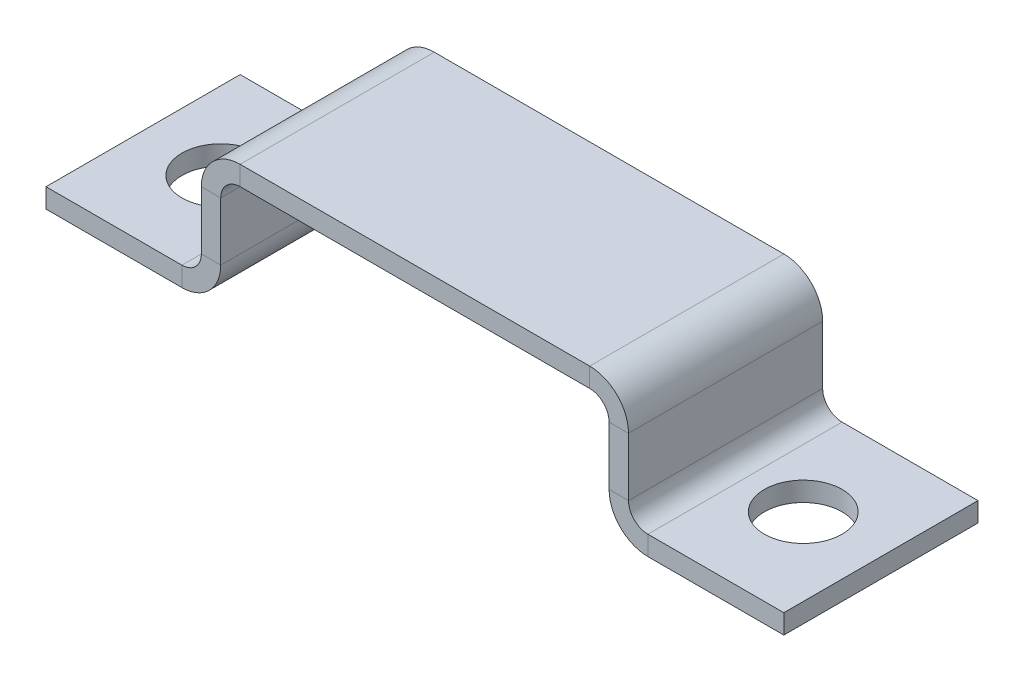
ISO-10303-21;
HEADER;
FILE_DESCRIPTION(('STEP AP214'),'2;1');
FILE_NAME('part.step','',(''),(''),'','','');
FILE_SCHEMA(('AUTOMOTIVE_DESIGN { 1 0 10303 214 1 1 1 1 }'));
ENDSEC;
DATA;
#1=APPLICATION_CONTEXT('core data for automotive mechanical design processes');
#2=APPLICATION_PROTOCOL_DEFINITION('international standard','automotive_design',2000,#1);
#3=PRODUCT_CONTEXT('',#1,'mechanical');
#4=PRODUCT('Part','Part','',(#3));
#5=PRODUCT_RELATED_PRODUCT_CATEGORY('part','',(#4));
#6=PRODUCT_DEFINITION_FORMATION('','',#4);
#7=PRODUCT_DEFINITION_CONTEXT('part definition',#1,'design');
#8=PRODUCT_DEFINITION('design','',#6,#7);
#9=PRODUCT_DEFINITION_SHAPE('','',#8);
#10=(LENGTH_UNIT() NAMED_UNIT(*) SI_UNIT(.MILLI.,.METRE.));
#11=(NAMED_UNIT(*) PLANE_ANGLE_UNIT() SI_UNIT($,.RADIAN.));
#12=(NAMED_UNIT(*) SI_UNIT($,.STERADIAN.) SOLID_ANGLE_UNIT());
#13=UNCERTAINTY_MEASURE_WITH_UNIT(LENGTH_MEASURE(1.E-05),#10,'distance_accuracy_value','');
#14=(GEOMETRIC_REPRESENTATION_CONTEXT(3) GLOBAL_UNCERTAINTY_ASSIGNED_CONTEXT((#13)) GLOBAL_UNIT_ASSIGNED_CONTEXT((#10,
#11,#12)) REPRESENTATION_CONTEXT('',''));
#15=CARTESIAN_POINT('',(0.,0.,0.));
#16=DIRECTION('',(0.,0.,1.));
#17=DIRECTION('',(1.,0.,0.));
#18=AXIS2_PLACEMENT_3D('',#15,#16,#17);
#19=CARTESIAN_POINT('',(-6.,0.,5.));
#20=DIRECTION('',(0.,0.,1.));
#21=DIRECTION('',(1.,0.,0.));
#22=AXIS2_PLACEMENT_3D('',#19,#20,#21);
#23=PLANE('',#22);
#24=DIRECTION('',(0.,1.,0.));
#25=VECTOR('',#24,1.);
#26=CARTESIAN_POINT('',(-6.,0.,5.));
#27=LINE('',#26,#25);
#28=CARTESIAN_POINT('',(-6.,0.,5.));
#29=VERTEX_POINT('',#28);
#30=CARTESIAN_POINT('',(-6.,0.5,5.));
#31=VERTEX_POINT('',#30);
#32=EDGE_CURVE('E11',#29,#31,#27,.T.);
#33=ORIENTED_EDGE('',*,*,#32,.F.);
#34=CARTESIAN_POINT('',(-6.,1.,5.));
#35=DIRECTION('',(0.,0.,-1.));
#36=DIRECTION('',(-1.,0.,0.));
#37=AXIS2_PLACEMENT_3D('',#34,#35,#36);
#38=CIRCLE('',#37,1.);
#39=CARTESIAN_POINT('',(-5.,1.,5.));
#40=VERTEX_POINT('',#39);
#41=EDGE_CURVE('E360',#40,#29,#38,.T.);
#42=ORIENTED_EDGE('',*,*,#41,.F.);
#43=DIRECTION('',(1.,0.,0.));
#44=VECTOR('',#43,1.);
#45=CARTESIAN_POINT('',(-5.5,1.,5.));
#46=LINE('',#45,#44);
#47=CARTESIAN_POINT('',(-5.5,1.,5.));
#48=VERTEX_POINT('',#47);
#49=EDGE_CURVE('E50',#48,#40,#46,.T.);
#50=ORIENTED_EDGE('',*,*,#49,.F.);
#51=CARTESIAN_POINT('',(-6.,1.,5.));
#52=DIRECTION('',(0.,0.,1.));
#53=DIRECTION('',(1.,0.,0.));
#54=AXIS2_PLACEMENT_3D('',#51,#52,#53);
#55=CIRCLE('',#54,0.5);
#56=EDGE_CURVE('E222',#48,#31,#55,.F.);
#57=ORIENTED_EDGE('',*,*,#56,.T.);
#58=EDGE_LOOP('',(#33,#42,#50,#57));
#59=FACE_BOUND('',#58,.T.);
#60=ADVANCED_FACE('F41',(#59),#23,.T.);
#61=CARTESIAN_POINT('',(-5.5,1.,5.));
#62=DIRECTION('',(0.,0.,1.));
#63=DIRECTION('',(1.,0.,0.));
#64=AXIS2_PLACEMENT_3D('',#61,#62,#63);
#65=PLANE('',#64);
#66=DIRECTION('',(-1.,0.,0.));
#67=VECTOR('',#66,1.);
#68=CARTESIAN_POINT('',(-9.5,0.,5.));
#69=LINE('',#68,#67);
#70=CARTESIAN_POINT('',(-9.5,0.,5.));
#71=VERTEX_POINT('',#70);
#72=EDGE_CURVE('E364',#29,#71,#69,.T.);
#73=ORIENTED_EDGE('',*,*,#72,.F.);
#74=ORIENTED_EDGE('',*,*,#32,.T.);
#75=DIRECTION('',(1.,0.,0.));
#76=VECTOR('',#75,1.);
#77=CARTESIAN_POINT('',(-9.5,0.5,5.));
#78=LINE('',#77,#76);
#79=CARTESIAN_POINT('',(-9.5,0.5,5.));
#80=VERTEX_POINT('',#79);
#81=EDGE_CURVE('E134',#31,#80,#78,.F.);
#82=ORIENTED_EDGE('',*,*,#81,.T.);
#83=DIRECTION('',(0.,1.,0.));
#84=VECTOR('',#83,1.);
#85=CARTESIAN_POINT('',(-9.5,0.,5.));
#86=LINE('',#85,#84);
#87=EDGE_CURVE('E912',#71,#80,#86,.T.);
#88=ORIENTED_EDGE('',*,*,#87,.F.);
#89=EDGE_LOOP('',(#73,#74,#82,#88));
#90=FACE_BOUND('',#89,.T.);
#91=ADVANCED_FACE('F493',(#90),#65,.T.);
#92=CARTESIAN_POINT('',(-5.,1.,0.));
#93=DIRECTION('',(0.,0.,-1.));
#94=DIRECTION('',(-1.,0.,0.));
#95=AXIS2_PLACEMENT_3D('',#92,#93,#94);
#96=PLANE('',#95);
#97=DIRECTION('',(-1.,0.,0.));
#98=VECTOR('',#97,1.);
#99=CARTESIAN_POINT('',(-5.,1.,0.));
#100=LINE('',#99,#98);
#101=CARTESIAN_POINT('',(-5.,1.,0.));
#102=VERTEX_POINT('',#101);
#103=CARTESIAN_POINT('',(-5.5,1.,0.));
#104=VERTEX_POINT('',#103);
#105=EDGE_CURVE('E121',#102,#104,#100,.T.);
#106=ORIENTED_EDGE('',*,*,#105,.F.);
#107=CARTESIAN_POINT('',(-6.,1.,0.));
#108=DIRECTION('',(0.,0.,-1.));
#109=DIRECTION('',(-1.,0.,0.));
#110=AXIS2_PLACEMENT_3D('',#107,#108,#109);
#111=CIRCLE('',#110,1.);
#112=CARTESIAN_POINT('',(-6.,0.,0.));
#113=VERTEX_POINT('',#112);
#114=EDGE_CURVE('E237',#102,#113,#111,.T.);
#115=ORIENTED_EDGE('',*,*,#114,.T.);
#116=DIRECTION('',(0.,-1.,0.));
#117=VECTOR('',#116,1.);
#118=CARTESIAN_POINT('',(-6.,0.5,0.));
#119=LINE('',#118,#117);
#120=CARTESIAN_POINT('',(-6.,0.5,0.));
#121=VERTEX_POINT('',#120);
#122=EDGE_CURVE('E128',#121,#113,#119,.T.);
#123=ORIENTED_EDGE('',*,*,#122,.F.);
#124=CARTESIAN_POINT('',(-6.,1.,0.));
#125=DIRECTION('',(0.,0.,1.));
#126=DIRECTION('',(1.,0.,0.));
#127=AXIS2_PLACEMENT_3D('',#124,#125,#126);
#128=CIRCLE('',#127,0.5);
#129=EDGE_CURVE('E280',#104,#121,#128,.F.);
#130=ORIENTED_EDGE('',*,*,#129,.F.);
#131=EDGE_LOOP('',(#106,#115,#123,#130));
#132=FACE_BOUND('',#131,.T.);
#133=ADVANCED_FACE('F497',(#132),#96,.T.);
#134=CARTESIAN_POINT('',(-6.,0.5,0.));
#135=DIRECTION('',(0.,0.,-1.));
#136=DIRECTION('',(-1.,0.,0.));
#137=AXIS2_PLACEMENT_3D('',#134,#135,#136);
#138=PLANE('',#137);
#139=DIRECTION('',(0.,-1.,0.));
#140=VECTOR('',#139,1.);
#141=CARTESIAN_POINT('',(-5.,0.,0.));
#142=LINE('',#141,#140);
#143=CARTESIAN_POINT('',(-5.,2.5,0.));
#144=VERTEX_POINT('',#143);
#145=EDGE_CURVE('E239',#144,#102,#142,.T.);
#146=ORIENTED_EDGE('',*,*,#145,.T.);
#147=ORIENTED_EDGE('',*,*,#105,.T.);
#148=DIRECTION('',(0.,1.,0.));
#149=VECTOR('',#148,1.);
#150=CARTESIAN_POINT('',(-5.5,0.,0.));
#151=LINE('',#150,#149);
#152=CARTESIAN_POINT('',(-5.5,2.5,0.));
#153=VERTEX_POINT('',#152);
#154=EDGE_CURVE('E278',#153,#104,#151,.F.);
#155=ORIENTED_EDGE('',*,*,#154,.F.);
#156=DIRECTION('',(1.,0.,0.));
#157=VECTOR('',#156,1.);
#158=CARTESIAN_POINT('',(-5.5,2.5,0.));
#159=LINE('',#158,#157);
#160=EDGE_CURVE('E346',#153,#144,#159,.T.);
#161=ORIENTED_EDGE('',*,*,#160,.T.);
#162=EDGE_LOOP('',(#146,#147,#155,#161));
#163=FACE_BOUND('',#162,.T.);
#164=ADVANCED_FACE('F413',(#163),#138,.T.);
#165=CARTESIAN_POINT('',(-5.,2.5,5.));
#166=DIRECTION('',(0.,0.,1.));
#167=DIRECTION('',(1.,0.,0.));
#168=AXIS2_PLACEMENT_3D('',#165,#166,#167);
#169=PLANE('',#168);
#170=DIRECTION('',(-1.,0.,0.));
#171=VECTOR('',#170,1.);
#172=CARTESIAN_POINT('',(-5.,2.5,5.));
#173=LINE('',#172,#171);
#174=CARTESIAN_POINT('',(-5.,2.5,5.));
#175=VERTEX_POINT('',#174);
#176=CARTESIAN_POINT('',(-5.5,2.5,5.));
#177=VERTEX_POINT('',#176);
#178=EDGE_CURVE('E186',#175,#177,#173,.T.);
#179=ORIENTED_EDGE('',*,*,#178,.F.);
#180=CARTESIAN_POINT('',(-4.5,2.5,5.));
#181=DIRECTION('',(0.,0.,1.));
#182=DIRECTION('',(1.,0.,0.));
#183=AXIS2_PLACEMENT_3D('',#180,#181,#182);
#184=CIRCLE('',#183,0.5);
#185=CARTESIAN_POINT('',(-4.5,3.,5.));
#186=VERTEX_POINT('',#185);
#187=EDGE_CURVE('E367',#186,#175,#184,.T.);
#188=ORIENTED_EDGE('',*,*,#187,.F.);
#189=DIRECTION('',(0.,-1.,0.));
#190=VECTOR('',#189,1.);
#191=CARTESIAN_POINT('',(-4.5,3.5,5.));
#192=LINE('',#191,#190);
#193=CARTESIAN_POINT('',(-4.5,3.5,5.));
#194=VERTEX_POINT('',#193);
#195=EDGE_CURVE('E198',#194,#186,#192,.T.);
#196=ORIENTED_EDGE('',*,*,#195,.F.);
#197=CARTESIAN_POINT('',(-4.5,2.5,5.));
#198=DIRECTION('',(0.,0.,1.));
#199=DIRECTION('',(1.,0.,0.));
#200=AXIS2_PLACEMENT_3D('',#197,#198,#199);
#201=CIRCLE('',#200,1.);
#202=EDGE_CURVE('E201',#194,#177,#201,.T.);
#203=ORIENTED_EDGE('',*,*,#202,.T.);
#204=EDGE_LOOP('',(#179,#188,#196,#203));
#205=FACE_BOUND('',#204,.T.);
#206=ADVANCED_FACE('F203',(#205),#169,.T.);
#207=CARTESIAN_POINT('',(-4.5,3.5,5.));
#208=DIRECTION('',(0.,0.,1.));
#209=DIRECTION('',(1.,0.,0.));
#210=AXIS2_PLACEMENT_3D('',#207,#208,#209);
#211=PLANE('',#210);
#212=DIRECTION('',(0.,-1.,0.));
#213=VECTOR('',#212,1.);
#214=CARTESIAN_POINT('',(-5.,0.,5.));
#215=LINE('',#214,#213);
#216=EDGE_CURVE('E193',#175,#40,#215,.T.);
#217=ORIENTED_EDGE('',*,*,#216,.F.);
#218=ORIENTED_EDGE('',*,*,#178,.T.);
#219=DIRECTION('',(0.,1.,0.));
#220=VECTOR('',#219,1.);
#221=CARTESIAN_POINT('',(-5.5,0.,5.));
#222=LINE('',#221,#220);
#223=EDGE_CURVE('E190',#177,#48,#222,.F.);
#224=ORIENTED_EDGE('',*,*,#223,.T.);
#225=ORIENTED_EDGE('',*,*,#49,.T.);
#226=EDGE_LOOP('',(#217,#218,#224,#225));
#227=FACE_BOUND('',#226,.T.);
#228=ADVANCED_FACE('F188',(#227),#211,.T.);
#229=CARTESIAN_POINT('',(-4.5,3.,0.));
#230=DIRECTION('',(0.,0.,-1.));
#231=DIRECTION('',(-1.,0.,0.));
#232=AXIS2_PLACEMENT_3D('',#229,#230,#231);
#233=PLANE('',#232);
#234=DIRECTION('',(0.,1.,0.));
#235=VECTOR('',#234,1.);
#236=CARTESIAN_POINT('',(-4.5,3.,0.));
#237=LINE('',#236,#235);
#238=CARTESIAN_POINT('',(-4.5,3.,0.));
#239=VERTEX_POINT('',#238);
#240=CARTESIAN_POINT('',(-4.5,3.5,0.));
#241=VERTEX_POINT('',#240);
#242=EDGE_CURVE('E348',#239,#241,#237,.T.);
#243=ORIENTED_EDGE('',*,*,#242,.F.);
#244=CARTESIAN_POINT('',(-4.5,2.5,0.));
#245=DIRECTION('',(0.,0.,1.));
#246=DIRECTION('',(1.,0.,0.));
#247=AXIS2_PLACEMENT_3D('',#244,#245,#246);
#248=CIRCLE('',#247,0.5);
#249=EDGE_CURVE('E241',#239,#144,#248,.T.);
#250=ORIENTED_EDGE('',*,*,#249,.T.);
#251=ORIENTED_EDGE('',*,*,#160,.F.);
#252=CARTESIAN_POINT('',(-4.5,2.5,0.));
#253=DIRECTION('',(0.,0.,1.));
#254=DIRECTION('',(1.,0.,0.));
#255=AXIS2_PLACEMENT_3D('',#252,#253,#254);
#256=CIRCLE('',#255,1.);
#257=EDGE_CURVE('E214',#241,#153,#256,.T.);
#258=ORIENTED_EDGE('',*,*,#257,.F.);
#259=EDGE_LOOP('',(#243,#250,#251,#258));
#260=FACE_BOUND('',#259,.T.);
#261=ADVANCED_FACE('F411',(#260),#233,.T.);
#262=CARTESIAN_POINT('',(-5.5,2.5,0.));
#263=DIRECTION('',(0.,0.,-1.));
#264=DIRECTION('',(-1.,0.,0.));
#265=AXIS2_PLACEMENT_3D('',#262,#263,#264);
#266=PLANE('',#265);
#267=DIRECTION('',(-1.,0.,0.));
#268=VECTOR('',#267,1.);
#269=CARTESIAN_POINT('',(-5.,3.,0.));
#270=LINE('',#269,#268);
#271=CARTESIAN_POINT('',(4.5,3.,0.));
#272=VERTEX_POINT('',#271);
#273=EDGE_CURVE('E244',#272,#239,#270,.T.);
#274=ORIENTED_EDGE('',*,*,#273,.T.);
#275=ORIENTED_EDGE('',*,*,#242,.T.);
#276=DIRECTION('',(-1.,0.,0.));
#277=VECTOR('',#276,1.);
#278=CARTESIAN_POINT('',(-5.,3.5,0.));
#279=LINE('',#278,#277);
#280=CARTESIAN_POINT('',(4.5,3.5,0.));
#281=VERTEX_POINT('',#280);
#282=EDGE_CURVE('E274',#281,#241,#279,.T.);
#283=ORIENTED_EDGE('',*,*,#282,.F.);
#284=DIRECTION('',(0.,-1.,0.));
#285=VECTOR('',#284,1.);
#286=CARTESIAN_POINT('',(4.5,3.5,0.));
#287=LINE('',#286,#285);
#288=EDGE_CURVE('E338',#281,#272,#287,.T.);
#289=ORIENTED_EDGE('',*,*,#288,.T.);
#290=EDGE_LOOP('',(#274,#275,#283,#289));
#291=FACE_BOUND('',#290,.T.);
#292=ADVANCED_FACE('F472',(#291),#266,.T.);
#293=CARTESIAN_POINT('',(4.5,3.,5.));
#294=DIRECTION('',(0.,0.,1.));
#295=DIRECTION('',(1.,0.,0.));
#296=AXIS2_PLACEMENT_3D('',#293,#294,#295);
#297=PLANE('',#296);
#298=DIRECTION('',(0.,1.,0.));
#299=VECTOR('',#298,1.);
#300=CARTESIAN_POINT('',(4.5,3.,5.));
#301=LINE('',#300,#299);
#302=CARTESIAN_POINT('',(4.5,3.,5.));
#303=VERTEX_POINT('',#302);
#304=CARTESIAN_POINT('',(4.5,3.5,5.));
#305=VERTEX_POINT('',#304);
#306=EDGE_CURVE('E344',#303,#305,#301,.T.);
#307=ORIENTED_EDGE('',*,*,#306,.F.);
#308=CARTESIAN_POINT('',(4.5,2.5,5.));
#309=DIRECTION('',(0.,0.,1.));
#310=DIRECTION('',(1.,0.,0.));
#311=AXIS2_PLACEMENT_3D('',#308,#309,#310);
#312=CIRCLE('',#311,0.5);
#313=CARTESIAN_POINT('',(5.,2.5,5.));
#314=VERTEX_POINT('',#313);
#315=EDGE_CURVE('E375',#314,#303,#312,.T.);
#316=ORIENTED_EDGE('',*,*,#315,.F.);
#317=DIRECTION('',(-1.,0.,0.));
#318=VECTOR('',#317,1.);
#319=CARTESIAN_POINT('',(5.5,2.5,5.));
#320=LINE('',#319,#318);
#321=CARTESIAN_POINT('',(5.5,2.5,5.));
#322=VERTEX_POINT('',#321);
#323=EDGE_CURVE('E342',#322,#314,#320,.T.);
#324=ORIENTED_EDGE('',*,*,#323,.F.);
#325=CARTESIAN_POINT('',(4.5,2.5,5.));
#326=DIRECTION('',(0.,0.,1.));
#327=DIRECTION('',(1.,0.,0.));
#328=AXIS2_PLACEMENT_3D('',#325,#326,#327);
#329=CIRCLE('',#328,1.);
#330=EDGE_CURVE('E399',#322,#305,#329,.T.);
#331=ORIENTED_EDGE('',*,*,#330,.T.);
#332=EDGE_LOOP('',(#307,#316,#324,#331));
#333=FACE_BOUND('',#332,.T.);
#334=ADVANCED_FACE('F426',(#333),#297,.T.);
#335=CARTESIAN_POINT('',(5.5,2.5,5.));
#336=DIRECTION('',(0.,0.,1.));
#337=DIRECTION('',(1.,0.,0.));
#338=AXIS2_PLACEMENT_3D('',#335,#336,#337);
#339=PLANE('',#338);
#340=DIRECTION('',(-1.,0.,0.));
#341=VECTOR('',#340,1.);
#342=CARTESIAN_POINT('',(-5.,3.,5.));
#343=LINE('',#342,#341);
#344=EDGE_CURVE('E369',#303,#186,#343,.T.);
#345=ORIENTED_EDGE('',*,*,#344,.F.);
#346=ORIENTED_EDGE('',*,*,#306,.T.);
#347=DIRECTION('',(-1.,0.,0.));
#348=VECTOR('',#347,1.);
#349=CARTESIAN_POINT('',(-5.,3.5,5.));
#350=LINE('',#349,#348);
#351=EDGE_CURVE('E207',#305,#194,#350,.T.);
#352=ORIENTED_EDGE('',*,*,#351,.T.);
#353=ORIENTED_EDGE('',*,*,#195,.T.);
#354=EDGE_LOOP('',(#345,#346,#352,#353));
#355=FACE_BOUND('',#354,.T.);
#356=ADVANCED_FACE('F405',(#355),#339,.T.);
#357=CARTESIAN_POINT('',(5.,2.5,0.));
#358=DIRECTION('',(0.,0.,-1.));
#359=DIRECTION('',(-1.,0.,0.));
#360=AXIS2_PLACEMENT_3D('',#357,#358,#359);
#361=PLANE('',#360);
#362=DIRECTION('',(1.,0.,0.));
#363=VECTOR('',#362,1.);
#364=CARTESIAN_POINT('',(5.,2.5,0.));
#365=LINE('',#364,#363);
#366=CARTESIAN_POINT('',(5.,2.5,0.));
#367=VERTEX_POINT('',#366);
#368=CARTESIAN_POINT('',(5.5,2.5,0.));
#369=VERTEX_POINT('',#368);
#370=EDGE_CURVE('E340',#367,#369,#365,.T.);
#371=ORIENTED_EDGE('',*,*,#370,.F.);
#372=CARTESIAN_POINT('',(4.5,2.5,0.));
#373=DIRECTION('',(0.,0.,1.));
#374=DIRECTION('',(1.,0.,0.));
#375=AXIS2_PLACEMENT_3D('',#372,#373,#374);
#376=CIRCLE('',#375,0.5);
#377=EDGE_CURVE('E247',#367,#272,#376,.T.);
#378=ORIENTED_EDGE('',*,*,#377,.T.);
#379=ORIENTED_EDGE('',*,*,#288,.F.);
#380=CARTESIAN_POINT('',(4.5,2.5,0.));
#381=DIRECTION('',(0.,0.,1.));
#382=DIRECTION('',(1.,0.,0.));
#383=AXIS2_PLACEMENT_3D('',#380,#381,#382);
#384=CIRCLE('',#383,1.);
#385=EDGE_CURVE('E271',#369,#281,#384,.T.);
#386=ORIENTED_EDGE('',*,*,#385,.F.);
#387=EDGE_LOOP('',(#371,#378,#379,#386));
#388=FACE_BOUND('',#387,.T.);
#389=ADVANCED_FACE('F474',(#388),#361,.T.);
#390=CARTESIAN_POINT('',(4.5,3.5,0.));
#391=DIRECTION('',(0.,0.,-1.));
#392=DIRECTION('',(-1.,0.,0.));
#393=AXIS2_PLACEMENT_3D('',#390,#391,#392);
#394=PLANE('',#393);
#395=DIRECTION('',(0.,1.,0.));
#396=VECTOR('',#395,1.);
#397=CARTESIAN_POINT('',(5.,0.,0.));
#398=LINE('',#397,#396);
#399=CARTESIAN_POINT('',(5.,0.999999999999999,0.));
#400=VERTEX_POINT('',#399);
#401=EDGE_CURVE('E250',#400,#367,#398,.T.);
#402=ORIENTED_EDGE('',*,*,#401,.T.);
#403=ORIENTED_EDGE('',*,*,#370,.T.);
#404=DIRECTION('',(0.,1.,0.));
#405=VECTOR('',#404,1.);
#406=CARTESIAN_POINT('',(5.5,0.,0.));
#407=LINE('',#406,#405);
#408=CARTESIAN_POINT('',(5.5,1.,0.));
#409=VERTEX_POINT('',#408);
#410=EDGE_CURVE('E268',#409,#369,#407,.T.);
#411=ORIENTED_EDGE('',*,*,#410,.F.);
#412=DIRECTION('',(-1.,0.,0.));
#413=VECTOR('',#412,1.);
#414=CARTESIAN_POINT('',(5.5,1.,0.));
#415=LINE('',#414,#413);
#416=EDGE_CURVE('E330',#409,#400,#415,.T.);
#417=ORIENTED_EDGE('',*,*,#416,.T.);
#418=EDGE_LOOP('',(#402,#403,#411,#417));
#419=FACE_BOUND('',#418,.T.);
#420=ADVANCED_FACE('F476',(#419),#394,.T.);
#421=CARTESIAN_POINT('',(5.,0.999999999999999,5.));
#422=DIRECTION('',(0.,0.,1.));
#423=DIRECTION('',(1.,0.,0.));
#424=AXIS2_PLACEMENT_3D('',#421,#422,#423);
#425=PLANE('',#424);
#426=DIRECTION('',(1.,0.,0.));
#427=VECTOR('',#426,1.);
#428=CARTESIAN_POINT('',(5.,0.999999999999999,5.));
#429=LINE('',#428,#427);
#430=CARTESIAN_POINT('',(5.,0.999999999999999,5.));
#431=VERTEX_POINT('',#430);
#432=CARTESIAN_POINT('',(5.5,1.,5.));
#433=VERTEX_POINT('',#432);
#434=EDGE_CURVE('E336',#431,#433,#429,.T.);
#435=ORIENTED_EDGE('',*,*,#434,.F.);
#436=CARTESIAN_POINT('',(6.,1.,5.));
#437=DIRECTION('',(0.,0.,-1.));
#438=DIRECTION('',(-1.,0.,0.));
#439=AXIS2_PLACEMENT_3D('',#436,#437,#438);
#440=CIRCLE('',#439,1.);
#441=CARTESIAN_POINT('',(6.,0.,5.));
#442=VERTEX_POINT('',#441);
#443=EDGE_CURVE('E381',#442,#431,#440,.T.);
#444=ORIENTED_EDGE('',*,*,#443,.F.);
#445=DIRECTION('',(0.,-1.,0.));
#446=VECTOR('',#445,1.);
#447=CARTESIAN_POINT('',(6.,0.500000000000001,5.));
#448=LINE('',#447,#446);
#449=CARTESIAN_POINT('',(6.,0.500000000000001,5.));
#450=VERTEX_POINT('',#449);
#451=EDGE_CURVE('E334',#450,#442,#448,.T.);
#452=ORIENTED_EDGE('',*,*,#451,.F.);
#453=CARTESIAN_POINT('',(6.,1.,5.));
#454=DIRECTION('',(0.,0.,1.));
#455=DIRECTION('',(1.,0.,0.));
#456=AXIS2_PLACEMENT_3D('',#453,#454,#455);
#457=CIRCLE('',#456,0.5);
#458=EDGE_CURVE('E393',#450,#433,#457,.F.);
#459=ORIENTED_EDGE('',*,*,#458,.T.);
#460=EDGE_LOOP('',(#435,#444,#452,#459));
#461=FACE_BOUND('',#460,.T.);
#462=ADVANCED_FACE('F440',(#461),#425,.T.);
#463=CARTESIAN_POINT('',(6.,0.500000000000001,5.));
#464=DIRECTION('',(0.,0.,1.));
#465=DIRECTION('',(1.,0.,0.));
#466=AXIS2_PLACEMENT_3D('',#463,#464,#465);
#467=PLANE('',#466);
#468=DIRECTION('',(0.,1.,0.));
#469=VECTOR('',#468,1.);
#470=CARTESIAN_POINT('',(5.,0.,5.));
#471=LINE('',#470,#469);
#472=EDGE_CURVE('E378',#431,#314,#471,.T.);
#473=ORIENTED_EDGE('',*,*,#472,.F.);
#474=ORIENTED_EDGE('',*,*,#434,.T.);
#475=DIRECTION('',(0.,1.,0.));
#476=VECTOR('',#475,1.);
#477=CARTESIAN_POINT('',(5.5,0.,5.));
#478=LINE('',#477,#476);
#479=EDGE_CURVE('E396',#433,#322,#478,.T.);
#480=ORIENTED_EDGE('',*,*,#479,.T.);
#481=ORIENTED_EDGE('',*,*,#323,.T.);
#482=EDGE_LOOP('',(#473,#474,#480,#481));
#483=FACE_BOUND('',#482,.T.);
#484=ADVANCED_FACE('F433',(#483),#467,.T.);
#485=CARTESIAN_POINT('',(6.,0.,0.));
#486=DIRECTION('',(0.,0.,-1.));
#487=DIRECTION('',(-1.,0.,0.));
#488=AXIS2_PLACEMENT_3D('',#485,#486,#487);
#489=PLANE('',#488);
#490=DIRECTION('',(0.,1.,0.));
#491=VECTOR('',#490,1.);
#492=CARTESIAN_POINT('',(6.,0.,0.));
#493=LINE('',#492,#491);
#494=CARTESIAN_POINT('',(6.,0.,0.));
#495=VERTEX_POINT('',#494);
#496=CARTESIAN_POINT('',(6.,0.500000000000001,0.));
#497=VERTEX_POINT('',#496);
#498=EDGE_CURVE('E332',#495,#497,#493,.T.);
#499=ORIENTED_EDGE('',*,*,#498,.F.);
#500=CARTESIAN_POINT('',(6.,1.,0.));
#501=DIRECTION('',(0.,0.,-1.));
#502=DIRECTION('',(-1.,0.,0.));
#503=AXIS2_PLACEMENT_3D('',#500,#501,#502);
#504=CIRCLE('',#503,1.);
#505=EDGE_CURVE('E253',#495,#400,#504,.T.);
#506=ORIENTED_EDGE('',*,*,#505,.T.);
#507=ORIENTED_EDGE('',*,*,#416,.F.);
#508=CARTESIAN_POINT('',(6.,1.,0.));
#509=DIRECTION('',(0.,0.,1.));
#510=DIRECTION('',(1.,0.,0.));
#511=AXIS2_PLACEMENT_3D('',#508,#509,#510);
#512=CIRCLE('',#511,0.5);
#513=EDGE_CURVE('E265',#497,#409,#512,.F.);
#514=ORIENTED_EDGE('',*,*,#513,.F.);
#515=EDGE_LOOP('',(#499,#506,#507,#514));
#516=FACE_BOUND('',#515,.T.);
#517=ADVANCED_FACE('F478',(#516),#489,.T.);
#518=CARTESIAN_POINT('',(5.5,1.,0.));
#519=DIRECTION('',(0.,0.,-1.));
#520=DIRECTION('',(-1.,0.,0.));
#521=AXIS2_PLACEMENT_3D('',#518,#519,#520);
#522=PLANE('',#521);
#523=DIRECTION('',(-1.,0.,0.));
#524=VECTOR('',#523,1.);
#525=CARTESIAN_POINT('',(9.50000000000001,0.,0.));
#526=LINE('',#525,#524);
#527=CARTESIAN_POINT('',(9.50000000000001,0.,0.));
#528=VERTEX_POINT('',#527);
#529=EDGE_CURVE('E256',#528,#495,#526,.T.);
#530=ORIENTED_EDGE('',*,*,#529,.T.);
#531=ORIENTED_EDGE('',*,*,#498,.T.);
#532=DIRECTION('',(-1.,0.,0.));
#533=VECTOR('',#532,1.);
#534=CARTESIAN_POINT('',(9.50000000000001,0.500000000000002,0.));
#535=LINE('',#534,#533);
#536=CARTESIAN_POINT('',(9.50000000000001,0.500000000000002,0.));
#537=VERTEX_POINT('',#536);
#538=EDGE_CURVE('E262',#537,#497,#535,.T.);
#539=ORIENTED_EDGE('',*,*,#538,.F.);
#540=DIRECTION('',(0.,-1.,0.));
#541=VECTOR('',#540,1.);
#542=CARTESIAN_POINT('',(9.50000000000001,0.500000000000002,0.));
#543=LINE('',#542,#541);
#544=EDGE_CURVE('E259',#537,#528,#543,.T.);
#545=ORIENTED_EDGE('',*,*,#544,.T.);
#546=EDGE_LOOP('',(#530,#531,#539,#545));
#547=FACE_BOUND('',#546,.T.);
#548=ADVANCED_FACE('F480',(#547),#522,.T.);
#549=CARTESIAN_POINT('',(-9.5,0.5,5.));
#550=DIRECTION('',(0.,-1.,0.));
#551=DIRECTION('',(0.,0.,-1.));
#552=AXIS2_PLACEMENT_3D('',#549,#550,#551);
#553=PLANE('',#552);
#554=CARTESIAN_POINT('',(-7.5,0.5,2.5));
#555=DIRECTION('',(0.,1.,0.));
#556=DIRECTION('',(-1.,0.,0.));
#557=AXIS2_PLACEMENT_3D('',#554,#555,#556);
#558=CIRCLE('',#557,1.);
#559=CARTESIAN_POINT('',(-8.5,0.5,2.5));
#560=VERTEX_POINT('',#559);
#561=EDGE_CURVE('E902',#560,#560,#558,.T.);
#562=ORIENTED_EDGE('',*,*,#561,.F.);
#563=EDGE_LOOP('',(#562));
#564=FACE_BOUND('',#563,.T.);
#565=DIRECTION('',(1.,0.,0.));
#566=VECTOR('',#565,1.);
#567=CARTESIAN_POINT('',(-9.5,0.5,0.));
#568=LINE('',#567,#566);
#569=CARTESIAN_POINT('',(-9.5,0.5,0.));
#570=VERTEX_POINT('',#569);
#571=EDGE_CURVE('E228',#121,#570,#568,.F.);
#572=ORIENTED_EDGE('',*,*,#571,.T.);
#573=DIRECTION('',(0.,0.,-1.));
#574=VECTOR('',#573,1.);
#575=CARTESIAN_POINT('',(-9.5,0.5,5.));
#576=LINE('',#575,#574);
#577=EDGE_CURVE('E328',#80,#570,#576,.T.);
#578=ORIENTED_EDGE('',*,*,#577,.F.);
#579=ORIENTED_EDGE('',*,*,#81,.F.);
#580=DIRECTION('',(0.,0.,-1.));
#581=VECTOR('',#580,1.);
#582=CARTESIAN_POINT('',(-6.,0.5,5.));
#583=LINE('',#582,#581);
#584=EDGE_CURVE('E224',#31,#121,#583,.T.);
#585=ORIENTED_EDGE('',*,*,#584,.T.);
#586=EDGE_LOOP('',(#572,#578,#579,#585));
#587=FACE_BOUND('',#586,.T.);
#588=ADVANCED_FACE('F482',(#564,#587),#553,.F.);
#589=CARTESIAN_POINT('',(-9.5,0.,5.));
#590=DIRECTION('',(-1.,0.,0.));
#591=DIRECTION('',(0.,0.,1.));
#592=AXIS2_PLACEMENT_3D('',#589,#590,#591);
#593=PLANE('',#592);
#594=DIRECTION('',(0.,1.,0.));
#595=VECTOR('',#594,1.);
#596=CARTESIAN_POINT('',(-9.5,0.,0.));
#597=LINE('',#596,#595);
#598=CARTESIAN_POINT('',(-9.5,0.,0.));
#599=VERTEX_POINT('',#598);
#600=EDGE_CURVE('E231',#599,#570,#597,.T.);
#601=ORIENTED_EDGE('',*,*,#600,.F.);
#602=DIRECTION('',(0.,0.,-1.));
#603=VECTOR('',#602,1.);
#604=CARTESIAN_POINT('',(-9.5,0.,5.));
#605=LINE('',#604,#603);
#606=EDGE_CURVE('E326',#71,#599,#605,.T.);
#607=ORIENTED_EDGE('',*,*,#606,.F.);
#608=ORIENTED_EDGE('',*,*,#87,.T.);
#609=ORIENTED_EDGE('',*,*,#577,.T.);
#610=EDGE_LOOP('',(#601,#607,#608,#609));
#611=FACE_BOUND('',#610,.T.);
#612=ADVANCED_FACE('F488',(#611),#593,.T.);
#613=CARTESIAN_POINT('',(-9.5,0.,5.));
#614=DIRECTION('',(0.,-1.,0.));
#615=DIRECTION('',(0.,0.,-1.));
#616=AXIS2_PLACEMENT_3D('',#613,#614,#615);
#617=PLANE('',#616);
#618=CARTESIAN_POINT('',(-7.5,0.,2.5));
#619=DIRECTION('',(0.,-1.,0.));
#620=DIRECTION('',(0.,0.,-1.));
#621=AXIS2_PLACEMENT_3D('',#618,#619,#620);
#622=CIRCLE('',#621,1.);
#623=CARTESIAN_POINT('',(-7.5,0.,1.5));
#624=VERTEX_POINT('',#623);
#625=EDGE_CURVE('E44',#624,#624,#622,.T.);
#626=ORIENTED_EDGE('',*,*,#625,.F.);
#627=EDGE_LOOP('',(#626));
#628=FACE_BOUND('',#627,.T.);
#629=DIRECTION('',(-1.,0.,0.));
#630=VECTOR('',#629,1.);
#631=CARTESIAN_POINT('',(-9.5,0.,0.));
#632=LINE('',#631,#630);
#633=EDGE_CURVE('E234',#113,#599,#632,.T.);
#634=ORIENTED_EDGE('',*,*,#633,.F.);
#635=DIRECTION('',(0.,0.,-1.));
#636=VECTOR('',#635,1.);
#637=CARTESIAN_POINT('',(-6.,0.,5.));
#638=LINE('',#637,#636);
#639=EDGE_CURVE('E323',#29,#113,#638,.T.);
#640=ORIENTED_EDGE('',*,*,#639,.F.);
#641=ORIENTED_EDGE('',*,*,#72,.T.);
#642=ORIENTED_EDGE('',*,*,#606,.T.);
#643=EDGE_LOOP('',(#634,#640,#641,#642));
#644=FACE_BOUND('',#643,.T.);
#645=ADVANCED_FACE('F548',(#628,#644),#617,.T.);
#646=CARTESIAN_POINT('',(-6.,1.,5.));
#647=DIRECTION('',(0.,0.,-1.));
#648=DIRECTION('',(-1.,0.,0.));
#649=AXIS2_PLACEMENT_3D('',#646,#647,#648);
#650=CYLINDRICAL_SURFACE('',#649,1.);
#651=ORIENTED_EDGE('',*,*,#114,.F.);
#652=DIRECTION('',(0.,0.,-1.));
#653=VECTOR('',#652,1.);
#654=CARTESIAN_POINT('',(-5.,1.,5.));
#655=LINE('',#654,#653);
#656=EDGE_CURVE('E320',#40,#102,#655,.T.);
#657=ORIENTED_EDGE('',*,*,#656,.F.);
#658=ORIENTED_EDGE('',*,*,#41,.T.);
#659=ORIENTED_EDGE('',*,*,#639,.T.);
#660=EDGE_LOOP('',(#651,#657,#658,#659));
#661=FACE_BOUND('',#660,.T.);
#662=ADVANCED_FACE('F359',(#661),#650,.T.);
#663=CARTESIAN_POINT('',(-5.,0.,5.));
#664=DIRECTION('',(1.,0.,0.));
#665=DIRECTION('',(0.,0.,-1.));
#666=AXIS2_PLACEMENT_3D('',#663,#664,#665);
#667=PLANE('',#666);
#668=ORIENTED_EDGE('',*,*,#145,.F.);
#669=DIRECTION('',(0.,0.,-1.));
#670=VECTOR('',#669,1.);
#671=CARTESIAN_POINT('',(-5.,2.5,5.));
#672=LINE('',#671,#670);
#673=EDGE_CURVE('E317',#175,#144,#672,.T.);
#674=ORIENTED_EDGE('',*,*,#673,.F.);
#675=ORIENTED_EDGE('',*,*,#216,.T.);
#676=ORIENTED_EDGE('',*,*,#656,.T.);
#677=EDGE_LOOP('',(#668,#674,#675,#676));
#678=FACE_BOUND('',#677,.T.);
#679=ADVANCED_FACE('F366',(#678),#667,.T.);
#680=CARTESIAN_POINT('',(-4.5,2.5,5.));
#681=DIRECTION('',(0.,0.,-1.));
#682=DIRECTION('',(-1.,0.,0.));
#683=AXIS2_PLACEMENT_3D('',#680,#681,#682);
#684=CYLINDRICAL_SURFACE('',#683,0.5);
#685=ORIENTED_EDGE('',*,*,#249,.F.);
#686=DIRECTION('',(0.,0.,-1.));
#687=VECTOR('',#686,1.);
#688=CARTESIAN_POINT('',(-4.5,3.,5.));
#689=LINE('',#688,#687);
#690=EDGE_CURVE('E314',#186,#239,#689,.T.);
#691=ORIENTED_EDGE('',*,*,#690,.F.);
#692=ORIENTED_EDGE('',*,*,#187,.T.);
#693=ORIENTED_EDGE('',*,*,#673,.T.);
#694=EDGE_LOOP('',(#685,#691,#692,#693));
#695=FACE_BOUND('',#694,.T.);
#696=ADVANCED_FACE('F415',(#695),#684,.F.);
#697=CARTESIAN_POINT('',(-5.,3.,5.));
#698=DIRECTION('',(0.,-1.,0.));
#699=DIRECTION('',(1.,0.,0.));
#700=AXIS2_PLACEMENT_3D('',#697,#698,#699);
#701=PLANE('',#700);
#702=ORIENTED_EDGE('',*,*,#273,.F.);
#703=DIRECTION('',(0.,0.,-1.));
#704=VECTOR('',#703,1.);
#705=CARTESIAN_POINT('',(4.5,3.,5.));
#706=LINE('',#705,#704);
#707=EDGE_CURVE('E311',#303,#272,#706,.T.);
#708=ORIENTED_EDGE('',*,*,#707,.F.);
#709=ORIENTED_EDGE('',*,*,#344,.T.);
#710=ORIENTED_EDGE('',*,*,#690,.T.);
#711=EDGE_LOOP('',(#702,#708,#709,#710));
#712=FACE_BOUND('',#711,.T.);
#713=ADVANCED_FACE('F419',(#712),#701,.T.);
#714=CARTESIAN_POINT('',(4.5,2.5,5.));
#715=DIRECTION('',(0.,0.,-1.));
#716=DIRECTION('',(-1.,0.,0.));
#717=AXIS2_PLACEMENT_3D('',#714,#715,#716);
#718=CYLINDRICAL_SURFACE('',#717,0.5);
#719=ORIENTED_EDGE('',*,*,#377,.F.);
#720=DIRECTION('',(0.,0.,-1.));
#721=VECTOR('',#720,1.);
#722=CARTESIAN_POINT('',(5.,2.5,5.));
#723=LINE('',#722,#721);
#724=EDGE_CURVE('E308',#314,#367,#723,.T.);
#725=ORIENTED_EDGE('',*,*,#724,.F.);
#726=ORIENTED_EDGE('',*,*,#315,.T.);
#727=ORIENTED_EDGE('',*,*,#707,.T.);
#728=EDGE_LOOP('',(#719,#725,#726,#727));
#729=FACE_BOUND('',#728,.T.);
#730=ADVANCED_FACE('F424',(#729),#718,.F.);
#731=CARTESIAN_POINT('',(5.,0.,5.));
#732=DIRECTION('',(-1.,0.,0.));
#733=DIRECTION('',(0.,-1.,0.));
#734=AXIS2_PLACEMENT_3D('',#731,#732,#733);
#735=PLANE('',#734);
#736=ORIENTED_EDGE('',*,*,#401,.F.);
#737=DIRECTION('',(0.,0.,-1.));
#738=VECTOR('',#737,1.);
#739=CARTESIAN_POINT('',(5.,0.999999999999999,5.));
#740=LINE('',#739,#738);
#741=EDGE_CURVE('E305',#431,#400,#740,.T.);
#742=ORIENTED_EDGE('',*,*,#741,.F.);
#743=ORIENTED_EDGE('',*,*,#472,.T.);
#744=ORIENTED_EDGE('',*,*,#724,.T.);
#745=EDGE_LOOP('',(#736,#742,#743,#744));
#746=FACE_BOUND('',#745,.T.);
#747=ADVANCED_FACE('F431',(#746),#735,.T.);
#748=CARTESIAN_POINT('',(6.,1.,5.));
#749=DIRECTION('',(0.,0.,-1.));
#750=DIRECTION('',(-1.,0.,0.));
#751=AXIS2_PLACEMENT_3D('',#748,#749,#750);
#752=CYLINDRICAL_SURFACE('',#751,1.);
#753=ORIENTED_EDGE('',*,*,#505,.F.);
#754=DIRECTION('',(0.,0.,-1.));
#755=VECTOR('',#754,1.);
#756=CARTESIAN_POINT('',(6.,0.,5.));
#757=LINE('',#756,#755);
#758=EDGE_CURVE('E302',#442,#495,#757,.T.);
#759=ORIENTED_EDGE('',*,*,#758,.F.);
#760=ORIENTED_EDGE('',*,*,#443,.T.);
#761=ORIENTED_EDGE('',*,*,#741,.T.);
#762=EDGE_LOOP('',(#753,#759,#760,#761));
#763=FACE_BOUND('',#762,.T.);
#764=ADVANCED_FACE('F438',(#763),#752,.T.);
#765=CARTESIAN_POINT('',(9.50000000000001,0.,5.));
#766=DIRECTION('',(0.,-1.,0.));
#767=DIRECTION('',(1.,0.,0.));
#768=AXIS2_PLACEMENT_3D('',#765,#766,#767);
#769=PLANE('',#768);
#770=CARTESIAN_POINT('',(7.5,0.,2.5));
#771=DIRECTION('',(0.,-1.,0.));
#772=DIRECTION('',(1.,0.,0.));
#773=AXIS2_PLACEMENT_3D('',#770,#771,#772);
#774=CIRCLE('',#773,1.);
#775=CARTESIAN_POINT('',(8.5,0.,2.5));
#776=VERTEX_POINT('',#775);
#777=EDGE_CURVE('E903',#776,#776,#774,.T.);
#778=ORIENTED_EDGE('',*,*,#777,.F.);
#779=EDGE_LOOP('',(#778));
#780=FACE_BOUND('',#779,.T.);
#781=ORIENTED_EDGE('',*,*,#529,.F.);
#782=DIRECTION('',(0.,0.,-1.));
#783=VECTOR('',#782,1.);
#784=CARTESIAN_POINT('',(9.50000000000001,0.,5.));
#785=LINE('',#784,#783);
#786=CARTESIAN_POINT('',(9.50000000000001,0.,5.));
#787=VERTEX_POINT('',#786);
#788=EDGE_CURVE('E300',#787,#528,#785,.T.);
#789=ORIENTED_EDGE('',*,*,#788,.F.);
#790=DIRECTION('',(-1.,0.,0.));
#791=VECTOR('',#790,1.);
#792=CARTESIAN_POINT('',(9.50000000000001,0.,5.));
#793=LINE('',#792,#791);
#794=EDGE_CURVE('E384',#787,#442,#793,.T.);
#795=ORIENTED_EDGE('',*,*,#794,.T.);
#796=ORIENTED_EDGE('',*,*,#758,.T.);
#797=EDGE_LOOP('',(#781,#789,#795,#796));
#798=FACE_BOUND('',#797,.T.);
#799=ADVANCED_FACE('F444',(#780,#798),#769,.T.);
#800=CARTESIAN_POINT('',(9.50000000000001,0.500000000000002,5.));
#801=DIRECTION('',(1.,0.,0.));
#802=DIRECTION('',(0.,0.,-1.));
#803=AXIS2_PLACEMENT_3D('',#800,#801,#802);
#804=PLANE('',#803);
#805=ORIENTED_EDGE('',*,*,#544,.F.);
#806=DIRECTION('',(0.,0.,-1.));
#807=VECTOR('',#806,1.);
#808=CARTESIAN_POINT('',(9.50000000000001,0.500000000000002,5.));
#809=LINE('',#808,#807);
#810=CARTESIAN_POINT('',(9.50000000000001,0.500000000000002,5.));
#811=VERTEX_POINT('',#810);
#812=EDGE_CURVE('E298',#811,#537,#809,.T.);
#813=ORIENTED_EDGE('',*,*,#812,.F.);
#814=DIRECTION('',(0.,-1.,0.));
#815=VECTOR('',#814,1.);
#816=CARTESIAN_POINT('',(9.50000000000001,0.500000000000002,5.));
#817=LINE('',#816,#815);
#818=EDGE_CURVE('E387',#811,#787,#817,.T.);
#819=ORIENTED_EDGE('',*,*,#818,.T.);
#820=ORIENTED_EDGE('',*,*,#788,.T.);
#821=EDGE_LOOP('',(#805,#813,#819,#820));
#822=FACE_BOUND('',#821,.T.);
#823=ADVANCED_FACE('F450',(#822),#804,.T.);
#824=CARTESIAN_POINT('',(9.50000000000001,0.500000000000002,5.));
#825=DIRECTION('',(0.,-1.,0.));
#826=DIRECTION('',(1.,0.,0.));
#827=AXIS2_PLACEMENT_3D('',#824,#825,#826);
#828=PLANE('',#827);
#829=CARTESIAN_POINT('',(7.5,0.5,2.5));
#830=DIRECTION('',(0.,1.,0.));
#831=DIRECTION('',(1.,0.,0.));
#832=AXIS2_PLACEMENT_3D('',#829,#830,#831);
#833=CIRCLE('',#832,1.);
#834=CARTESIAN_POINT('',(8.5,0.5,2.5));
#835=VERTEX_POINT('',#834);
#836=EDGE_CURVE('E904',#835,#835,#833,.T.);
#837=ORIENTED_EDGE('',*,*,#836,.F.);
#838=EDGE_LOOP('',(#837));
#839=FACE_BOUND('',#838,.T.);
#840=ORIENTED_EDGE('',*,*,#538,.T.);
#841=DIRECTION('',(0.,0.,-1.));
#842=VECTOR('',#841,1.);
#843=CARTESIAN_POINT('',(6.,0.500000000000001,5.));
#844=LINE('',#843,#842);
#845=EDGE_CURVE('E295',#450,#497,#844,.T.);
#846=ORIENTED_EDGE('',*,*,#845,.F.);
#847=DIRECTION('',(-1.,0.,0.));
#848=VECTOR('',#847,1.);
#849=CARTESIAN_POINT('',(9.50000000000001,0.500000000000002,5.));
#850=LINE('',#849,#848);
#851=EDGE_CURVE('E390',#811,#450,#850,.T.);
#852=ORIENTED_EDGE('',*,*,#851,.F.);
#853=ORIENTED_EDGE('',*,*,#812,.T.);
#854=EDGE_LOOP('',(#840,#846,#852,#853));
#855=FACE_BOUND('',#854,.T.);
#856=ADVANCED_FACE('F455',(#839,#855),#828,.F.);
#857=CARTESIAN_POINT('',(6.,1.,5.));
#858=DIRECTION('',(0.,0.,-1.));
#859=DIRECTION('',(-1.,0.,0.));
#860=AXIS2_PLACEMENT_3D('',#857,#858,#859);
#861=CYLINDRICAL_SURFACE('',#860,0.5);
#862=ORIENTED_EDGE('',*,*,#513,.T.);
#863=DIRECTION('',(0.,0.,-1.));
#864=VECTOR('',#863,1.);
#865=CARTESIAN_POINT('',(5.5,1.,5.));
#866=LINE('',#865,#864);
#867=EDGE_CURVE('E292',#433,#409,#866,.T.);
#868=ORIENTED_EDGE('',*,*,#867,.F.);
#869=ORIENTED_EDGE('',*,*,#458,.F.);
#870=ORIENTED_EDGE('',*,*,#845,.T.);
#871=EDGE_LOOP('',(#862,#868,#869,#870));
#872=FACE_BOUND('',#871,.T.);
#873=ADVANCED_FACE('F460',(#872),#861,.F.);
#874=CARTESIAN_POINT('',(5.5,0.,5.));
#875=DIRECTION('',(-1.,0.,0.));
#876=DIRECTION('',(0.,-1.,0.));
#877=AXIS2_PLACEMENT_3D('',#874,#875,#876);
#878=PLANE('',#877);
#879=ORIENTED_EDGE('',*,*,#410,.T.);
#880=DIRECTION('',(0.,0.,-1.));
#881=VECTOR('',#880,1.);
#882=CARTESIAN_POINT('',(5.5,2.5,5.));
#883=LINE('',#882,#881);
#884=EDGE_CURVE('E289',#322,#369,#883,.T.);
#885=ORIENTED_EDGE('',*,*,#884,.F.);
#886=ORIENTED_EDGE('',*,*,#479,.F.);
#887=ORIENTED_EDGE('',*,*,#867,.T.);
#888=EDGE_LOOP('',(#879,#885,#886,#887));
#889=FACE_BOUND('',#888,.T.);
#890=ADVANCED_FACE('F465',(#889),#878,.F.);
#891=CARTESIAN_POINT('',(4.5,2.5,5.));
#892=DIRECTION('',(0.,0.,-1.));
#893=DIRECTION('',(-1.,0.,0.));
#894=AXIS2_PLACEMENT_3D('',#891,#892,#893);
#895=CYLINDRICAL_SURFACE('',#894,1.);
#896=ORIENTED_EDGE('',*,*,#385,.T.);
#897=DIRECTION('',(0.,0.,-1.));
#898=VECTOR('',#897,1.);
#899=CARTESIAN_POINT('',(4.5,3.5,5.));
#900=LINE('',#899,#898);
#901=EDGE_CURVE('E286',#305,#281,#900,.T.);
#902=ORIENTED_EDGE('',*,*,#901,.F.);
#903=ORIENTED_EDGE('',*,*,#330,.F.);
#904=ORIENTED_EDGE('',*,*,#884,.T.);
#905=EDGE_LOOP('',(#896,#902,#903,#904));
#906=FACE_BOUND('',#905,.T.);
#907=ADVANCED_FACE('F470',(#906),#895,.T.);
#908=CARTESIAN_POINT('',(-5.,3.5,5.));
#909=DIRECTION('',(0.,-1.,0.));
#910=DIRECTION('',(1.,0.,0.));
#911=AXIS2_PLACEMENT_3D('',#908,#909,#910);
#912=PLANE('',#911);
#913=ORIENTED_EDGE('',*,*,#282,.T.);
#914=DIRECTION('',(0.,0.,-1.));
#915=VECTOR('',#914,1.);
#916=CARTESIAN_POINT('',(-4.5,3.5,5.));
#917=LINE('',#916,#915);
#918=EDGE_CURVE('E216',#194,#241,#917,.T.);
#919=ORIENTED_EDGE('',*,*,#918,.F.);
#920=ORIENTED_EDGE('',*,*,#351,.F.);
#921=ORIENTED_EDGE('',*,*,#901,.T.);
#922=EDGE_LOOP('',(#913,#919,#920,#921));
#923=FACE_BOUND('',#922,.T.);
#924=ADVANCED_FACE('F408',(#923),#912,.F.);
#925=CARTESIAN_POINT('',(-4.5,2.5,5.));
#926=DIRECTION('',(0.,0.,-1.));
#927=DIRECTION('',(-1.,0.,0.));
#928=AXIS2_PLACEMENT_3D('',#925,#926,#927);
#929=CYLINDRICAL_SURFACE('',#928,1.);
#930=ORIENTED_EDGE('',*,*,#257,.T.);
#931=DIRECTION('',(0.,0.,-1.));
#932=VECTOR('',#931,1.);
#933=CARTESIAN_POINT('',(-5.5,2.5,5.));
#934=LINE('',#933,#932);
#935=EDGE_CURVE('E211',#177,#153,#934,.T.);
#936=ORIENTED_EDGE('',*,*,#935,.F.);
#937=ORIENTED_EDGE('',*,*,#202,.F.);
#938=ORIENTED_EDGE('',*,*,#918,.T.);
#939=EDGE_LOOP('',(#930,#936,#937,#938));
#940=FACE_BOUND('',#939,.T.);
#941=ADVANCED_FACE('F212',(#940),#929,.T.);
#942=CARTESIAN_POINT('',(-5.5,0.,5.));
#943=DIRECTION('',(1.,0.,0.));
#944=DIRECTION('',(0.,0.,-1.));
#945=AXIS2_PLACEMENT_3D('',#942,#943,#944);
#946=PLANE('',#945);
#947=ORIENTED_EDGE('',*,*,#154,.T.);
#948=DIRECTION('',(0.,0.,-1.));
#949=VECTOR('',#948,1.);
#950=CARTESIAN_POINT('',(-5.5,1.,5.));
#951=LINE('',#950,#949);
#952=EDGE_CURVE('E217',#48,#104,#951,.T.);
#953=ORIENTED_EDGE('',*,*,#952,.F.);
#954=ORIENTED_EDGE('',*,*,#223,.F.);
#955=ORIENTED_EDGE('',*,*,#935,.T.);
#956=EDGE_LOOP('',(#947,#953,#954,#955));
#957=FACE_BOUND('',#956,.T.);
#958=ADVANCED_FACE('F219',(#957),#946,.F.);
#959=CARTESIAN_POINT('',(-6.,1.,5.));
#960=DIRECTION('',(0.,0.,-1.));
#961=DIRECTION('',(-1.,0.,0.));
#962=AXIS2_PLACEMENT_3D('',#959,#960,#961);
#963=CYLINDRICAL_SURFACE('',#962,0.5);
#964=ORIENTED_EDGE('',*,*,#129,.T.);
#965=ORIENTED_EDGE('',*,*,#584,.F.);
#966=ORIENTED_EDGE('',*,*,#56,.F.);
#967=ORIENTED_EDGE('',*,*,#952,.T.);
#968=EDGE_LOOP('',(#964,#965,#966,#967));
#969=FACE_BOUND('',#968,.T.);
#970=ADVANCED_FACE('F682',(#969),#963,.F.);
#971=CARTESIAN_POINT('',(-6.,1.,5.));
#972=DIRECTION('',(0.,0.,-1.));
#973=DIRECTION('',(-1.,0.,0.));
#974=AXIS2_PLACEMENT_3D('',#971,#972,#973);
#975=PLANE('',#974);
#976=ORIENTED_EDGE('',*,*,#851,.T.);
#977=ORIENTED_EDGE('',*,*,#451,.T.);
#978=ORIENTED_EDGE('',*,*,#794,.F.);
#979=ORIENTED_EDGE('',*,*,#818,.F.);
#980=EDGE_LOOP('',(#976,#977,#978,#979));
#981=FACE_BOUND('',#980,.T.);
#982=ADVANCED_FACE('F447',(#981),#975,.F.);
#983=CARTESIAN_POINT('',(-6.,1.,0.));
#984=DIRECTION('',(0.,0.,-1.));
#985=DIRECTION('',(-1.,0.,0.));
#986=AXIS2_PLACEMENT_3D('',#983,#984,#985);
#987=PLANE('',#986);
#988=ORIENTED_EDGE('',*,*,#571,.F.);
#989=ORIENTED_EDGE('',*,*,#122,.T.);
#990=ORIENTED_EDGE('',*,*,#633,.T.);
#991=ORIENTED_EDGE('',*,*,#600,.T.);
#992=EDGE_LOOP('',(#988,#989,#990,#991));
#993=FACE_BOUND('',#992,.T.);
#994=ADVANCED_FACE('F702',(#993),#987,.T.);
#995=CARTESIAN_POINT('',(7.5,-9.5,2.5));
#996=DIRECTION('',(0.,1.,0.));
#997=DIRECTION('',(-1.,0.,0.));
#998=AXIS2_PLACEMENT_3D('',#995,#996,#997);
#999=CYLINDRICAL_SURFACE('',#998,1.);
#1000=ORIENTED_EDGE('',*,*,#777,.T.);
#1001=EDGE_LOOP('',(#1000));
#1002=FACE_BOUND('',#1001,.T.);
#1003=ORIENTED_EDGE('',*,*,#836,.T.);
#1004=EDGE_LOOP('',(#1003));
#1005=FACE_BOUND('',#1004,.T.);
#1006=ADVANCED_FACE('F712',(#1002,#1005),#999,.F.);
#1007=CARTESIAN_POINT('',(-7.5,-9.5,2.5));
#1008=DIRECTION('',(0.,1.,0.));
#1009=DIRECTION('',(-1.,0.,0.));
#1010=AXIS2_PLACEMENT_3D('',#1007,#1008,#1009);
#1011=CYLINDRICAL_SURFACE('',#1010,1.);
#1012=ORIENTED_EDGE('',*,*,#625,.T.);
#1013=EDGE_LOOP('',(#1012));
#1014=FACE_BOUND('',#1013,.T.);
#1015=ORIENTED_EDGE('',*,*,#561,.T.);
#1016=EDGE_LOOP('',(#1015));
#1017=FACE_BOUND('',#1016,.T.);
#1018=ADVANCED_FACE('F753',(#1014,#1017),#1011,.F.);
#1019=CLOSED_SHELL('',(#60,#91,#133,#164,#206,#228,#261,#292,#334,#356,#389,#420,#462,#484,#517,
#548,#588,#612,#645,#662,#679,#696,#713,#730,#747,#764,#799,#823,#856,#873,#890,#907,#924,#941,
#958,#970,#982,#994,#1006,#1018));
#1020=MANIFOLD_SOLID_BREP('B2',#1019);
#1021=ADVANCED_BREP_SHAPE_REPRESENTATION('',(#18,#1020),#14);
#1022=SHAPE_DEFINITION_REPRESENTATION(#9,#1021);
ENDSEC;
END-ISO-10303-21;
